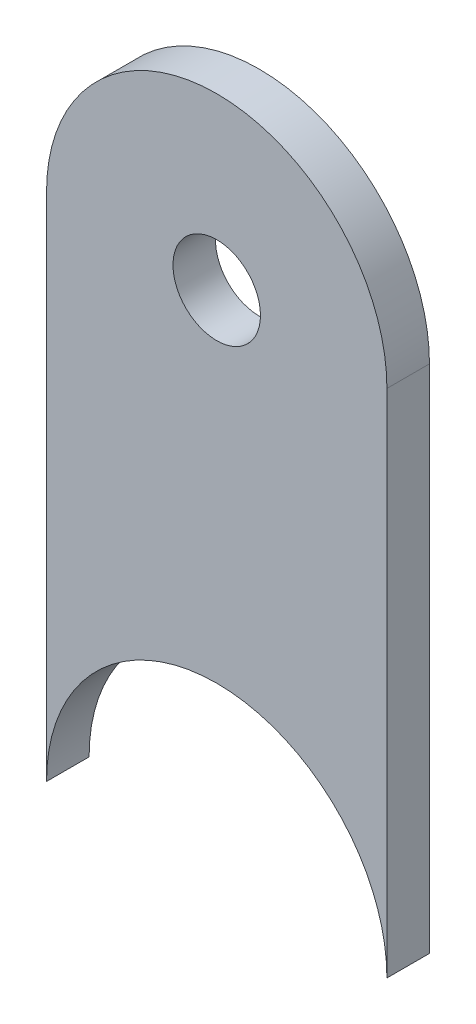
ISO-10303-21;
HEADER;
FILE_DESCRIPTION(('STEP AP214'),'2;1');
FILE_NAME('part.step','',(''),(''),'','','');
FILE_SCHEMA(('AUTOMOTIVE_DESIGN { 1 0 10303 214 1 1 1 1 }'));
ENDSEC;
DATA;
#1=APPLICATION_CONTEXT('core data for automotive mechanical design processes');
#2=APPLICATION_PROTOCOL_DEFINITION('international standard','automotive_design',2000,#1);
#3=PRODUCT_CONTEXT('',#1,'mechanical');
#4=PRODUCT('Part','Part','',(#3));
#5=PRODUCT_RELATED_PRODUCT_CATEGORY('part','',(#4));
#6=PRODUCT_DEFINITION_FORMATION('','',#4);
#7=PRODUCT_DEFINITION_CONTEXT('part definition',#1,'design');
#8=PRODUCT_DEFINITION('design','',#6,#7);
#9=PRODUCT_DEFINITION_SHAPE('','',#8);
#10=(LENGTH_UNIT() NAMED_UNIT(*) SI_UNIT(.MILLI.,.METRE.));
#11=(NAMED_UNIT(*) PLANE_ANGLE_UNIT() SI_UNIT($,.RADIAN.));
#12=(NAMED_UNIT(*) SI_UNIT($,.STERADIAN.) SOLID_ANGLE_UNIT());
#13=UNCERTAINTY_MEASURE_WITH_UNIT(LENGTH_MEASURE(1.E-05),#10,'distance_accuracy_value','');
#14=(GEOMETRIC_REPRESENTATION_CONTEXT(3) GLOBAL_UNCERTAINTY_ASSIGNED_CONTEXT((#13)) GLOBAL_UNIT_ASSIGNED_CONTEXT((#10,
#11,#12)) REPRESENTATION_CONTEXT('',''));
#15=CARTESIAN_POINT('',(0.,0.,0.));
#16=DIRECTION('',(0.,0.,1.));
#17=DIRECTION('',(1.,0.,0.));
#18=AXIS2_PLACEMENT_3D('',#15,#16,#17);
#19=CARTESIAN_POINT('',(0.,0.,-3.175));
#20=DIRECTION('',(-1.,0.,0.));
#21=DIRECTION('',(0.,-1.,0.));
#22=AXIS2_PLACEMENT_3D('',#19,#20,#21);
#23=PLANE('',#22);
#24=DIRECTION('',(0.,1.,0.));
#25=VECTOR('',#24,1.);
#26=CARTESIAN_POINT('',(0.,0.,0.));
#27=LINE('',#26,#25);
#28=CARTESIAN_POINT('',(0.,0.,0.));
#29=VERTEX_POINT('',#28);
#30=CARTESIAN_POINT('',(0.,38.1,0.));
#31=VERTEX_POINT('',#30);
#32=EDGE_CURVE('E113',#29,#31,#27,.T.);
#33=ORIENTED_EDGE('',*,*,#32,.T.);
#34=DIRECTION('',(0.,0.,1.));
#35=VECTOR('',#34,1.);
#36=CARTESIAN_POINT('',(0.,38.1,-3.175));
#37=LINE('',#36,#35);
#38=CARTESIAN_POINT('',(0.,38.1,-3.175));
#39=VERTEX_POINT('',#38);
#40=EDGE_CURVE('E112',#39,#31,#37,.T.);
#41=ORIENTED_EDGE('',*,*,#40,.F.);
#42=DIRECTION('',(0.,1.,0.));
#43=VECTOR('',#42,1.);
#44=CARTESIAN_POINT('',(0.,0.,-3.175));
#45=LINE('',#44,#43);
#46=CARTESIAN_POINT('',(0.,0.,-3.175));
#47=VERTEX_POINT('',#46);
#48=EDGE_CURVE('E103',#47,#39,#45,.T.);
#49=ORIENTED_EDGE('',*,*,#48,.F.);
#50=DIRECTION('',(0.,0.,1.));
#51=VECTOR('',#50,1.);
#52=CARTESIAN_POINT('',(0.,0.,-3.175));
#53=LINE('',#52,#51);
#54=EDGE_CURVE('E11',#47,#29,#53,.T.);
#55=ORIENTED_EDGE('',*,*,#54,.T.);
#56=EDGE_LOOP('',(#33,#41,#49,#55));
#57=FACE_BOUND('',#56,.T.);
#58=ADVANCED_FACE('F45',(#57),#23,.T.);
#59=CARTESIAN_POINT('',(12.7,0.,-3.175));
#60=DIRECTION('',(0.,0.,1.));
#61=DIRECTION('',(-1.,0.,0.));
#62=AXIS2_PLACEMENT_3D('',#59,#60,#61);
#63=CYLINDRICAL_SURFACE('',#62,12.7);
#64=CARTESIAN_POINT('',(12.7,0.,0.));
#65=DIRECTION('',(0.,0.,1.));
#66=DIRECTION('',(1.,0.,0.));
#67=AXIS2_PLACEMENT_3D('',#64,#65,#66);
#68=CIRCLE('',#67,12.7);
#69=CARTESIAN_POINT('',(25.4,0.,0.));
#70=VERTEX_POINT('',#69);
#71=EDGE_CURVE('E116',#70,#29,#68,.T.);
#72=ORIENTED_EDGE('',*,*,#71,.T.);
#73=ORIENTED_EDGE('',*,*,#54,.F.);
#74=CARTESIAN_POINT('',(12.7,0.,-3.175));
#75=DIRECTION('',(0.,0.,1.));
#76=DIRECTION('',(1.,0.,0.));
#77=AXIS2_PLACEMENT_3D('',#74,#75,#76);
#78=CIRCLE('',#77,12.7);
#79=CARTESIAN_POINT('',(25.4,0.,-3.175));
#80=VERTEX_POINT('',#79);
#81=EDGE_CURVE('E86',#80,#47,#78,.T.);
#82=ORIENTED_EDGE('',*,*,#81,.F.);
#83=DIRECTION('',(0.,0.,1.));
#84=VECTOR('',#83,1.);
#85=CARTESIAN_POINT('',(25.4,0.,-3.175));
#86=LINE('',#85,#84);
#87=EDGE_CURVE('E53',#80,#70,#86,.T.);
#88=ORIENTED_EDGE('',*,*,#87,.T.);
#89=EDGE_LOOP('',(#72,#73,#82,#88));
#90=FACE_BOUND('',#89,.T.);
#91=ADVANCED_FACE('F101',(#90),#63,.F.);
#92=CARTESIAN_POINT('',(25.4,0.,-3.175));
#93=DIRECTION('',(-1.,0.,0.));
#94=DIRECTION('',(0.,-1.,0.));
#95=AXIS2_PLACEMENT_3D('',#92,#93,#94);
#96=PLANE('',#95);
#97=DIRECTION('',(0.,1.,0.));
#98=VECTOR('',#97,1.);
#99=CARTESIAN_POINT('',(25.4,0.,0.));
#100=LINE('',#99,#98);
#101=CARTESIAN_POINT('',(25.4,38.1,0.));
#102=VERTEX_POINT('',#101);
#103=EDGE_CURVE('E97',#70,#102,#100,.T.);
#104=ORIENTED_EDGE('',*,*,#103,.F.);
#105=ORIENTED_EDGE('',*,*,#87,.F.);
#106=DIRECTION('',(0.,1.,0.));
#107=VECTOR('',#106,1.);
#108=CARTESIAN_POINT('',(25.4,0.,-3.175));
#109=LINE('',#108,#107);
#110=CARTESIAN_POINT('',(25.4,38.1,-3.175));
#111=VERTEX_POINT('',#110);
#112=EDGE_CURVE('E89',#80,#111,#109,.T.);
#113=ORIENTED_EDGE('',*,*,#112,.T.);
#114=DIRECTION('',(0.,0.,1.));
#115=VECTOR('',#114,1.);
#116=CARTESIAN_POINT('',(25.4,38.1,-3.175));
#117=LINE('',#116,#115);
#118=EDGE_CURVE('E100',#111,#102,#117,.T.);
#119=ORIENTED_EDGE('',*,*,#118,.T.);
#120=EDGE_LOOP('',(#104,#105,#113,#119));
#121=FACE_BOUND('',#120,.T.);
#122=ADVANCED_FACE('F96',(#121),#96,.F.);
#123=CARTESIAN_POINT('',(12.7,38.1,-3.175));
#124=DIRECTION('',(0.,0.,1.));
#125=DIRECTION('',(-1.,0.,0.));
#126=AXIS2_PLACEMENT_3D('',#123,#124,#125);
#127=CYLINDRICAL_SURFACE('',#126,12.7);
#128=CARTESIAN_POINT('',(12.7,38.1,0.));
#129=DIRECTION('',(0.,0.,1.));
#130=DIRECTION('',(1.,0.,0.));
#131=AXIS2_PLACEMENT_3D('',#128,#129,#130);
#132=CIRCLE('',#131,12.7);
#133=EDGE_CURVE('E75',#31,#102,#132,.F.);
#134=ORIENTED_EDGE('',*,*,#133,.T.);
#135=ORIENTED_EDGE('',*,*,#118,.F.);
#136=CARTESIAN_POINT('',(12.7,38.1,-3.175));
#137=DIRECTION('',(0.,0.,1.));
#138=DIRECTION('',(1.,0.,0.));
#139=AXIS2_PLACEMENT_3D('',#136,#137,#138);
#140=CIRCLE('',#139,12.7);
#141=EDGE_CURVE('E61',#39,#111,#140,.F.);
#142=ORIENTED_EDGE('',*,*,#141,.F.);
#143=ORIENTED_EDGE('',*,*,#40,.T.);
#144=EDGE_LOOP('',(#134,#135,#142,#143));
#145=FACE_BOUND('',#144,.T.);
#146=ADVANCED_FACE('F127',(#145),#127,.T.);
#147=CARTESIAN_POINT('',(12.7,38.1,-3.175));
#148=DIRECTION('',(0.,0.,1.));
#149=DIRECTION('',(-1.,0.,0.));
#150=AXIS2_PLACEMENT_3D('',#147,#148,#149);
#151=CYLINDRICAL_SURFACE('',#150,3.2639);
#152=CARTESIAN_POINT('',(12.7,38.1,-3.175));
#153=DIRECTION('',(0.,0.,1.));
#154=DIRECTION('',(1.,0.,0.));
#155=AXIS2_PLACEMENT_3D('',#152,#153,#154);
#156=CIRCLE('',#155,3.2639);
#157=CARTESIAN_POINT('',(15.9639,38.1,-3.175));
#158=VERTEX_POINT('',#157);
#159=EDGE_CURVE('E109',#158,#158,#156,.T.);
#160=ORIENTED_EDGE('',*,*,#159,.F.);
#161=EDGE_LOOP('',(#160));
#162=FACE_BOUND('',#161,.T.);
#163=CARTESIAN_POINT('',(12.7,38.1,0.));
#164=DIRECTION('',(0.,0.,1.));
#165=DIRECTION('',(1.,0.,0.));
#166=AXIS2_PLACEMENT_3D('',#163,#164,#165);
#167=CIRCLE('',#166,3.2639);
#168=CARTESIAN_POINT('',(15.9639,38.1,0.));
#169=VERTEX_POINT('',#168);
#170=EDGE_CURVE('E105',#169,#169,#167,.T.);
#171=ORIENTED_EDGE('',*,*,#170,.T.);
#172=EDGE_LOOP('',(#171));
#173=FACE_BOUND('',#172,.T.);
#174=ADVANCED_FACE('F129',(#162,#173),#151,.F.);
#175=CARTESIAN_POINT('',(0.,0.,-3.175));
#176=DIRECTION('',(0.,0.,-1.));
#177=DIRECTION('',(1.,0.,0.));
#178=AXIS2_PLACEMENT_3D('',#175,#176,#177);
#179=PLANE('',#178);
#180=ORIENTED_EDGE('',*,*,#48,.T.);
#181=ORIENTED_EDGE('',*,*,#141,.T.);
#182=ORIENTED_EDGE('',*,*,#112,.F.);
#183=ORIENTED_EDGE('',*,*,#81,.T.);
#184=EDGE_LOOP('',(#180,#181,#182,#183));
#185=FACE_BOUND('',#184,.T.);
#186=ORIENTED_EDGE('',*,*,#159,.T.);
#187=EDGE_LOOP('',(#186));
#188=FACE_BOUND('',#187,.T.);
#189=ADVANCED_FACE('F91',(#185,#188),#179,.T.);
#190=CARTESIAN_POINT('',(0.,0.,0.));
#191=DIRECTION('',(0.,0.,-1.));
#192=DIRECTION('',(1.,0.,0.));
#193=AXIS2_PLACEMENT_3D('',#190,#191,#192);
#194=PLANE('',#193);
#195=ORIENTED_EDGE('',*,*,#32,.F.);
#196=ORIENTED_EDGE('',*,*,#71,.F.);
#197=ORIENTED_EDGE('',*,*,#103,.T.);
#198=ORIENTED_EDGE('',*,*,#133,.F.);
#199=EDGE_LOOP('',(#195,#196,#197,#198));
#200=FACE_BOUND('',#199,.T.);
#201=ORIENTED_EDGE('',*,*,#170,.F.);
#202=EDGE_LOOP('',(#201));
#203=FACE_BOUND('',#202,.T.);
#204=ADVANCED_FACE('F123',(#200,#203),#194,.F.);
#205=CLOSED_SHELL('',(#58,#91,#122,#146,#174,#189,#204));
#206=MANIFOLD_SOLID_BREP('B2',#205);
#207=ADVANCED_BREP_SHAPE_REPRESENTATION('',(#18,#206),#14);
#208=SHAPE_DEFINITION_REPRESENTATION(#9,#207);
ENDSEC;
END-ISO-10303-21;
